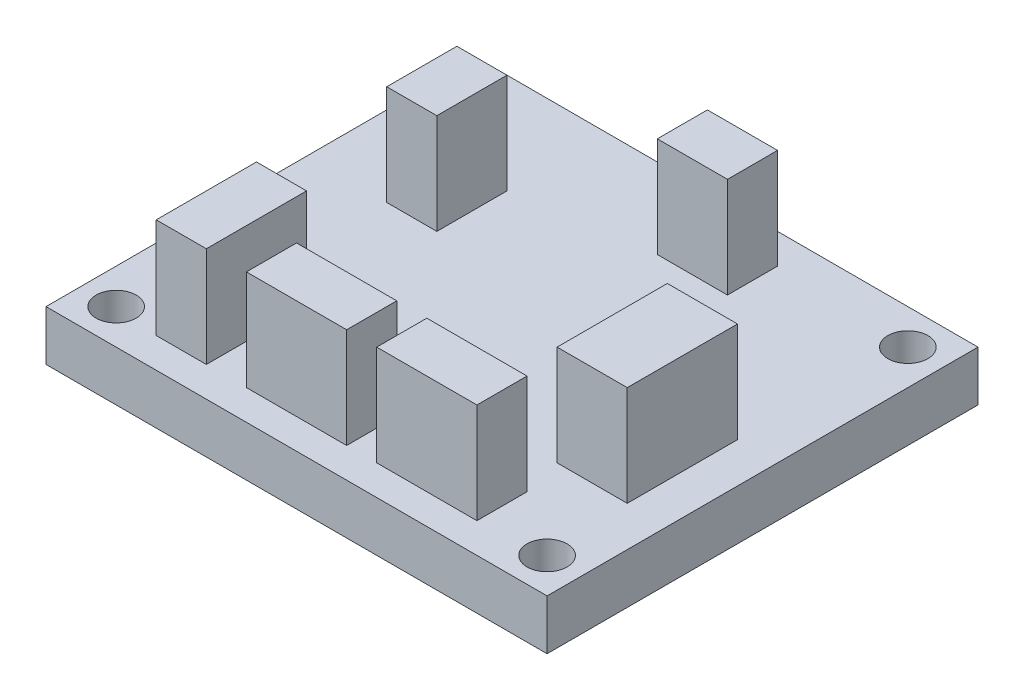
ISO-10303-21;
HEADER;
FILE_DESCRIPTION(('STEP AP214'),'2;1');
FILE_NAME('part.step','',(''),(''),'','','');
FILE_SCHEMA(('AUTOMOTIVE_DESIGN { 1 0 10303 214 1 1 1 1 }'));
ENDSEC;
DATA;
#1=APPLICATION_CONTEXT('core data for automotive mechanical design processes');
#2=APPLICATION_PROTOCOL_DEFINITION('international standard','automotive_design',2000,#1);
#3=PRODUCT_CONTEXT('',#1,'mechanical');
#4=PRODUCT('Part','Part','',(#3));
#5=PRODUCT_RELATED_PRODUCT_CATEGORY('part','',(#4));
#6=PRODUCT_DEFINITION_FORMATION('','',#4);
#7=PRODUCT_DEFINITION_CONTEXT('part definition',#1,'design');
#8=PRODUCT_DEFINITION('design','',#6,#7);
#9=PRODUCT_DEFINITION_SHAPE('','',#8);
#10=(LENGTH_UNIT() NAMED_UNIT(*) SI_UNIT(.MILLI.,.METRE.));
#11=(NAMED_UNIT(*) PLANE_ANGLE_UNIT() SI_UNIT($,.RADIAN.));
#12=(NAMED_UNIT(*) SI_UNIT($,.STERADIAN.) SOLID_ANGLE_UNIT());
#13=UNCERTAINTY_MEASURE_WITH_UNIT(LENGTH_MEASURE(1.E-05),#10,'distance_accuracy_value','');
#14=(GEOMETRIC_REPRESENTATION_CONTEXT(3) GLOBAL_UNCERTAINTY_ASSIGNED_CONTEXT((#13)) GLOBAL_UNIT_ASSIGNED_CONTEXT((#10,
#11,#12)) REPRESENTATION_CONTEXT('',''));
#15=CARTESIAN_POINT('',(0.,0.,0.));
#16=DIRECTION('',(0.,0.,1.));
#17=DIRECTION('',(1.,0.,0.));
#18=AXIS2_PLACEMENT_3D('',#15,#16,#17);
#19=CARTESIAN_POINT('',(0.,5.,0.));
#20=DIRECTION('',(0.,-1.,0.));
#21=DIRECTION('',(0.,0.,-1.));
#22=AXIS2_PLACEMENT_3D('',#19,#20,#21);
#23=PLANE('',#22);
#24=DIRECTION('',(0.,0.,-1.));
#25=VECTOR('',#24,1.);
#26=CARTESIAN_POINT('',(15.,5.,0.));
#27=LINE('',#26,#25);
#28=CARTESIAN_POINT('',(15.,5.,18.5));
#29=VERTEX_POINT('',#28);
#30=CARTESIAN_POINT('',(15.,5.,13.5));
#31=VERTEX_POINT('',#30);
#32=EDGE_CURVE('E278',#29,#31,#27,.T.);
#33=ORIENTED_EDGE('',*,*,#32,.F.);
#34=DIRECTION('',(1.,0.,0.));
#35=VECTOR('',#34,1.);
#36=CARTESIAN_POINT('',(0.,5.,18.5));
#37=LINE('',#36,#35);
#38=CARTESIAN_POINT('',(4.99999999999999,5.,18.5));
#39=VERTEX_POINT('',#38);
#40=EDGE_CURVE('E269',#39,#29,#37,.T.);
#41=ORIENTED_EDGE('',*,*,#40,.F.);
#42=DIRECTION('',(0.,0.,1.));
#43=VECTOR('',#42,1.);
#44=CARTESIAN_POINT('',(4.99999999999999,5.,0.));
#45=LINE('',#44,#43);
#46=CARTESIAN_POINT('',(4.99999999999999,5.,13.5));
#47=VERTEX_POINT('',#46);
#48=EDGE_CURVE('E272',#47,#39,#45,.T.);
#49=ORIENTED_EDGE('',*,*,#48,.F.);
#50=DIRECTION('',(-1.,0.,0.));
#51=VECTOR('',#50,1.);
#52=CARTESIAN_POINT('',(0.,5.,13.5));
#53=LINE('',#52,#51);
#54=EDGE_CURVE('E275',#31,#47,#53,.T.);
#55=ORIENTED_EDGE('',*,*,#54,.F.);
#56=EDGE_LOOP('',(#33,#41,#49,#55));
#57=FACE_BOUND('',#56,.T.);
#58=DIRECTION('',(0.,0.,1.));
#59=VECTOR('',#58,1.);
#60=CARTESIAN_POINT('',(0.999999999999995,5.,0.));
#61=LINE('',#60,#59);
#62=CARTESIAN_POINT('',(0.999999999999993,5.,-18.5));
#63=VERTEX_POINT('',#62);
#64=CARTESIAN_POINT('',(0.999999999999994,5.,-13.5));
#65=VERTEX_POINT('',#64);
#66=EDGE_CURVE('E344',#63,#65,#61,.T.);
#67=ORIENTED_EDGE('',*,*,#66,.F.);
#68=DIRECTION('',(-1.,0.,0.));
#69=VECTOR('',#68,1.);
#70=CARTESIAN_POINT('',(0.,5.,-18.5));
#71=LINE('',#70,#69);
#72=CARTESIAN_POINT('',(7.99999999999999,5.,-18.5));
#73=VERTEX_POINT('',#72);
#74=EDGE_CURVE('E335',#73,#63,#71,.T.);
#75=ORIENTED_EDGE('',*,*,#74,.F.);
#76=DIRECTION('',(0.,0.,-1.));
#77=VECTOR('',#76,1.);
#78=CARTESIAN_POINT('',(7.99999999999999,5.,0.));
#79=LINE('',#78,#77);
#80=CARTESIAN_POINT('',(7.99999999999999,5.,-13.5));
#81=VERTEX_POINT('',#80);
#82=EDGE_CURVE('E338',#81,#73,#79,.T.);
#83=ORIENTED_EDGE('',*,*,#82,.F.);
#84=DIRECTION('',(1.,0.,0.));
#85=VECTOR('',#84,1.);
#86=CARTESIAN_POINT('',(0.,5.,-13.5));
#87=LINE('',#86,#85);
#88=EDGE_CURVE('E341',#65,#81,#87,.T.);
#89=ORIENTED_EDGE('',*,*,#88,.F.);
#90=EDGE_LOOP('',(#67,#75,#83,#89));
#91=FACE_BOUND('',#90,.T.);
#92=DIRECTION('',(0.,0.,1.));
#93=VECTOR('',#92,1.);
#94=CARTESIAN_POINT('',(-17.,5.,0.));
#95=LINE('',#94,#93);
#96=CARTESIAN_POINT('',(-17.,5.,8.5));
#97=VERTEX_POINT('',#96);
#98=CARTESIAN_POINT('',(-17.,5.,18.5));
#99=VERTEX_POINT('',#98);
#100=EDGE_CURVE('E410',#97,#99,#95,.T.);
#101=ORIENTED_EDGE('',*,*,#100,.F.);
#102=DIRECTION('',(-1.,0.,0.));
#103=VECTOR('',#102,1.);
#104=CARTESIAN_POINT('',(0.,5.,8.5));
#105=LINE('',#104,#103);
#106=CARTESIAN_POINT('',(-12.,5.,8.5));
#107=VERTEX_POINT('',#106);
#108=EDGE_CURVE('E401',#107,#97,#105,.T.);
#109=ORIENTED_EDGE('',*,*,#108,.F.);
#110=DIRECTION('',(0.,0.,-1.));
#111=VECTOR('',#110,1.);
#112=CARTESIAN_POINT('',(-12.,5.,0.));
#113=LINE('',#112,#111);
#114=CARTESIAN_POINT('',(-12.,5.,18.5));
#115=VERTEX_POINT('',#114);
#116=EDGE_CURVE('E404',#115,#107,#113,.T.);
#117=ORIENTED_EDGE('',*,*,#116,.F.);
#118=DIRECTION('',(1.,0.,0.));
#119=VECTOR('',#118,1.);
#120=CARTESIAN_POINT('',(0.,5.,18.5));
#121=LINE('',#120,#119);
#122=EDGE_CURVE('E407',#99,#115,#121,.T.);
#123=ORIENTED_EDGE('',*,*,#122,.F.);
#124=EDGE_LOOP('',(#101,#109,#117,#123));
#125=FACE_BOUND('',#124,.T.);
#126=CARTESIAN_POINT('',(21.5,5.,18.));
#127=DIRECTION('',(0.,1.,0.));
#128=DIRECTION('',(0.,0.,1.));
#129=AXIS2_PLACEMENT_3D('',#126,#127,#128);
#130=CIRCLE('',#129,2.00000000000001);
#131=CARTESIAN_POINT('',(21.5,5.,20.));
#132=VERTEX_POINT('',#131);
#133=EDGE_CURVE('E420',#132,#132,#130,.T.);
#134=ORIENTED_EDGE('',*,*,#133,.F.);
#135=EDGE_LOOP('',(#134));
#136=FACE_BOUND('',#135,.T.);
#137=CARTESIAN_POINT('',(-21.5,5.,-18.));
#138=DIRECTION('',(0.,1.,0.));
#139=DIRECTION('',(0.,0.,1.));
#140=AXIS2_PLACEMENT_3D('',#137,#138,#139);
#141=CIRCLE('',#140,2.00000000000001);
#142=CARTESIAN_POINT('',(-21.5,5.,-16.));
#143=VERTEX_POINT('',#142);
#144=EDGE_CURVE('E432',#143,#143,#141,.T.);
#145=ORIENTED_EDGE('',*,*,#144,.F.);
#146=EDGE_LOOP('',(#145));
#147=FACE_BOUND('',#146,.T.);
#148=DIRECTION('',(0.,0.,-1.));
#149=VECTOR('',#148,1.);
#150=CARTESIAN_POINT('',(25.,5.,21.5));
#151=LINE('',#150,#149);
#152=CARTESIAN_POINT('',(25.,5.,21.5));
#153=VERTEX_POINT('',#152);
#154=CARTESIAN_POINT('',(25.,5.,-21.5));
#155=VERTEX_POINT('',#154);
#156=EDGE_CURVE('E438',#153,#155,#151,.T.);
#157=ORIENTED_EDGE('',*,*,#156,.T.);
#158=DIRECTION('',(-1.,0.,0.));
#159=VECTOR('',#158,1.);
#160=CARTESIAN_POINT('',(-25.,5.,-21.5));
#161=LINE('',#160,#159);
#162=CARTESIAN_POINT('',(-25.,5.,-21.5));
#163=VERTEX_POINT('',#162);
#164=EDGE_CURVE('E441',#155,#163,#161,.T.);
#165=ORIENTED_EDGE('',*,*,#164,.T.);
#166=DIRECTION('',(0.,0.,1.));
#167=VECTOR('',#166,1.);
#168=CARTESIAN_POINT('',(-25.,5.,21.5));
#169=LINE('',#168,#167);
#170=CARTESIAN_POINT('',(-25.,5.,21.5));
#171=VERTEX_POINT('',#170);
#172=EDGE_CURVE('E444',#163,#171,#169,.T.);
#173=ORIENTED_EDGE('',*,*,#172,.T.);
#174=DIRECTION('',(1.,0.,0.));
#175=VECTOR('',#174,1.);
#176=CARTESIAN_POINT('',(-25.,5.,21.5));
#177=LINE('',#176,#175);
#178=EDGE_CURVE('E446',#171,#153,#177,.T.);
#179=ORIENTED_EDGE('',*,*,#178,.T.);
#180=EDGE_LOOP('',(#157,#165,#173,#179));
#181=FACE_BOUND('',#180,.T.);
#182=CARTESIAN_POINT('',(21.5,5.,-18.));
#183=DIRECTION('',(0.,1.,0.));
#184=DIRECTION('',(0.,0.,-1.));
#185=AXIS2_PLACEMENT_3D('',#182,#183,#184);
#186=CIRCLE('',#185,2.00000000000001);
#187=CARTESIAN_POINT('',(21.5,5.,-20.));
#188=VERTEX_POINT('',#187);
#189=EDGE_CURVE('E426',#188,#188,#186,.T.);
#190=ORIENTED_EDGE('',*,*,#189,.F.);
#191=EDGE_LOOP('',(#190));
#192=FACE_BOUND('',#191,.T.);
#193=CARTESIAN_POINT('',(-21.5,5.,18.));
#194=DIRECTION('',(0.,1.,0.));
#195=DIRECTION('',(0.,0.,-1.));
#196=AXIS2_PLACEMENT_3D('',#193,#194,#195);
#197=CIRCLE('',#196,2.00000000000001);
#198=CARTESIAN_POINT('',(-21.5,5.,16.));
#199=VERTEX_POINT('',#198);
#200=EDGE_CURVE('E414',#199,#199,#197,.T.);
#201=ORIENTED_EDGE('',*,*,#200,.F.);
#202=EDGE_LOOP('',(#201));
#203=FACE_BOUND('',#202,.T.);
#204=DIRECTION('',(0.,0.,1.));
#205=VECTOR('',#204,1.);
#206=CARTESIAN_POINT('',(-17.,5.,0.));
#207=LINE('',#206,#205);
#208=CARTESIAN_POINT('',(-17.,5.,-11.5));
#209=VERTEX_POINT('',#208);
#210=CARTESIAN_POINT('',(-17.,5.,-4.5));
#211=VERTEX_POINT('',#210);
#212=EDGE_CURVE('E377',#209,#211,#207,.T.);
#213=ORIENTED_EDGE('',*,*,#212,.F.);
#214=DIRECTION('',(-1.,0.,0.));
#215=VECTOR('',#214,1.);
#216=CARTESIAN_POINT('',(0.,5.,-11.5));
#217=LINE('',#216,#215);
#218=CARTESIAN_POINT('',(-12.,5.,-11.5));
#219=VERTEX_POINT('',#218);
#220=EDGE_CURVE('E368',#219,#209,#217,.T.);
#221=ORIENTED_EDGE('',*,*,#220,.F.);
#222=DIRECTION('',(0.,0.,-1.));
#223=VECTOR('',#222,1.);
#224=CARTESIAN_POINT('',(-12.,5.,0.));
#225=LINE('',#224,#223);
#226=CARTESIAN_POINT('',(-12.,5.,-4.5));
#227=VERTEX_POINT('',#226);
#228=EDGE_CURVE('E371',#227,#219,#225,.T.);
#229=ORIENTED_EDGE('',*,*,#228,.F.);
#230=DIRECTION('',(1.,0.,0.));
#231=VECTOR('',#230,1.);
#232=CARTESIAN_POINT('',(0.,5.,-4.5));
#233=LINE('',#232,#231);
#234=EDGE_CURVE('E374',#211,#227,#233,.T.);
#235=ORIENTED_EDGE('',*,*,#234,.F.);
#236=EDGE_LOOP('',(#213,#221,#229,#235));
#237=FACE_BOUND('',#236,.T.);
#238=DIRECTION('',(0.,0.,1.));
#239=VECTOR('',#238,1.);
#240=CARTESIAN_POINT('',(14.,5.,0.));
#241=LINE('',#240,#239);
#242=CARTESIAN_POINT('',(14.,5.,-1.5));
#243=VERTEX_POINT('',#242);
#244=CARTESIAN_POINT('',(14.,5.,9.5));
#245=VERTEX_POINT('',#244);
#246=EDGE_CURVE('E311',#243,#245,#241,.T.);
#247=ORIENTED_EDGE('',*,*,#246,.F.);
#248=DIRECTION('',(-1.,0.,0.));
#249=VECTOR('',#248,1.);
#250=CARTESIAN_POINT('',(0.,5.,-1.5));
#251=LINE('',#250,#249);
#252=CARTESIAN_POINT('',(21.,5.,-1.5));
#253=VERTEX_POINT('',#252);
#254=EDGE_CURVE('E302',#253,#243,#251,.T.);
#255=ORIENTED_EDGE('',*,*,#254,.F.);
#256=DIRECTION('',(0.,0.,-1.));
#257=VECTOR('',#256,1.);
#258=CARTESIAN_POINT('',(21.,5.,0.));
#259=LINE('',#258,#257);
#260=CARTESIAN_POINT('',(21.,5.,9.5));
#261=VERTEX_POINT('',#260);
#262=EDGE_CURVE('E305',#261,#253,#259,.T.);
#263=ORIENTED_EDGE('',*,*,#262,.F.);
#264=DIRECTION('',(1.,0.,0.));
#265=VECTOR('',#264,1.);
#266=CARTESIAN_POINT('',(0.,5.,9.5));
#267=LINE('',#266,#265);
#268=EDGE_CURVE('E308',#245,#261,#267,.T.);
#269=ORIENTED_EDGE('',*,*,#268,.F.);
#270=EDGE_LOOP('',(#247,#255,#263,#269));
#271=FACE_BOUND('',#270,.T.);
#272=DIRECTION('',(0.,0.,-1.));
#273=VECTOR('',#272,1.);
#274=CARTESIAN_POINT('',(1.99999999999999,5.,0.));
#275=LINE('',#274,#273);
#276=CARTESIAN_POINT('',(1.99999999999999,5.,18.5));
#277=VERTEX_POINT('',#276);
#278=CARTESIAN_POINT('',(1.99999999999999,5.,13.5));
#279=VERTEX_POINT('',#278);
#280=EDGE_CURVE('E236',#277,#279,#275,.T.);
#281=ORIENTED_EDGE('',*,*,#280,.F.);
#282=DIRECTION('',(1.,0.,0.));
#283=VECTOR('',#282,1.);
#284=CARTESIAN_POINT('',(0.,5.,18.5));
#285=LINE('',#284,#283);
#286=CARTESIAN_POINT('',(-8.00000000000001,5.,18.5));
#287=VERTEX_POINT('',#286);
#288=EDGE_CURVE('E237',#287,#277,#285,.T.);
#289=ORIENTED_EDGE('',*,*,#288,.F.);
#290=DIRECTION('',(0.,0.,1.));
#291=VECTOR('',#290,1.);
#292=CARTESIAN_POINT('',(-8.00000000000001,5.,0.));
#293=LINE('',#292,#291);
#294=CARTESIAN_POINT('',(-8.00000000000001,5.,13.5));
#295=VERTEX_POINT('',#294);
#296=EDGE_CURVE('E52',#295,#287,#293,.T.);
#297=ORIENTED_EDGE('',*,*,#296,.F.);
#298=DIRECTION('',(-1.,0.,0.));
#299=VECTOR('',#298,1.);
#300=CARTESIAN_POINT('',(0.,5.,13.5));
#301=LINE('',#300,#299);
#302=EDGE_CURVE('E47',#279,#295,#301,.T.);
#303=ORIENTED_EDGE('',*,*,#302,.F.);
#304=EDGE_LOOP('',(#281,#289,#297,#303));
#305=FACE_BOUND('',#304,.T.);
#306=ADVANCED_FACE('F32',(#57,#91,#125,#136,#147,#181,#192,#203,#237,#271,#305),#23,.F.);
#307=CARTESIAN_POINT('',(0.,0.,0.));
#308=DIRECTION('',(0.,-1.,0.));
#309=DIRECTION('',(0.,0.,-1.));
#310=AXIS2_PLACEMENT_3D('',#307,#308,#309);
#311=PLANE('',#310);
#312=CARTESIAN_POINT('',(21.5,0.,18.));
#313=DIRECTION('',(0.,1.,0.));
#314=DIRECTION('',(0.,0.,1.));
#315=AXIS2_PLACEMENT_3D('',#312,#313,#314);
#316=CIRCLE('',#315,2.00000000000001);
#317=CARTESIAN_POINT('',(21.5,0.,20.));
#318=VERTEX_POINT('',#317);
#319=EDGE_CURVE('E417',#318,#318,#316,.T.);
#320=ORIENTED_EDGE('',*,*,#319,.T.);
#321=EDGE_LOOP('',(#320));
#322=FACE_BOUND('',#321,.T.);
#323=CARTESIAN_POINT('',(-21.5,0.,-18.));
#324=DIRECTION('',(0.,1.,0.));
#325=DIRECTION('',(0.,0.,1.));
#326=AXIS2_PLACEMENT_3D('',#323,#324,#325);
#327=CIRCLE('',#326,2.00000000000001);
#328=CARTESIAN_POINT('',(-21.5,0.,-16.));
#329=VERTEX_POINT('',#328);
#330=EDGE_CURVE('E429',#329,#329,#327,.T.);
#331=ORIENTED_EDGE('',*,*,#330,.T.);
#332=EDGE_LOOP('',(#331));
#333=FACE_BOUND('',#332,.T.);
#334=DIRECTION('',(0.,0.,-1.));
#335=VECTOR('',#334,1.);
#336=CARTESIAN_POINT('',(25.,0.,21.5));
#337=LINE('',#336,#335);
#338=CARTESIAN_POINT('',(25.,0.,21.5));
#339=VERTEX_POINT('',#338);
#340=CARTESIAN_POINT('',(25.,0.,-21.5));
#341=VERTEX_POINT('',#340);
#342=EDGE_CURVE('E435',#339,#341,#337,.T.);
#343=ORIENTED_EDGE('',*,*,#342,.F.);
#344=DIRECTION('',(1.,0.,0.));
#345=VECTOR('',#344,1.);
#346=CARTESIAN_POINT('',(-25.,0.,21.5));
#347=LINE('',#346,#345);
#348=CARTESIAN_POINT('',(-25.,0.,21.5));
#349=VERTEX_POINT('',#348);
#350=EDGE_CURVE('E442',#349,#339,#347,.T.);
#351=ORIENTED_EDGE('',*,*,#350,.F.);
#352=DIRECTION('',(0.,0.,1.));
#353=VECTOR('',#352,1.);
#354=CARTESIAN_POINT('',(-25.,0.,21.5));
#355=LINE('',#354,#353);
#356=CARTESIAN_POINT('',(-25.,0.,-21.5));
#357=VERTEX_POINT('',#356);
#358=EDGE_CURVE('E453',#357,#349,#355,.T.);
#359=ORIENTED_EDGE('',*,*,#358,.F.);
#360=DIRECTION('',(-1.,0.,0.));
#361=VECTOR('',#360,1.);
#362=CARTESIAN_POINT('',(-25.,0.,-21.5));
#363=LINE('',#362,#361);
#364=EDGE_CURVE('E451',#341,#357,#363,.T.);
#365=ORIENTED_EDGE('',*,*,#364,.F.);
#366=EDGE_LOOP('',(#343,#351,#359,#365));
#367=FACE_BOUND('',#366,.T.);
#368=CARTESIAN_POINT('',(21.5,0.,-18.));
#369=DIRECTION('',(0.,1.,0.));
#370=DIRECTION('',(0.,0.,-1.));
#371=AXIS2_PLACEMENT_3D('',#368,#369,#370);
#372=CIRCLE('',#371,2.00000000000001);
#373=CARTESIAN_POINT('',(21.5,0.,-20.));
#374=VERTEX_POINT('',#373);
#375=EDGE_CURVE('E423',#374,#374,#372,.T.);
#376=ORIENTED_EDGE('',*,*,#375,.T.);
#377=EDGE_LOOP('',(#376));
#378=FACE_BOUND('',#377,.T.);
#379=CARTESIAN_POINT('',(-21.5,0.,18.));
#380=DIRECTION('',(0.,1.,0.));
#381=DIRECTION('',(0.,0.,-1.));
#382=AXIS2_PLACEMENT_3D('',#379,#380,#381);
#383=CIRCLE('',#382,2.00000000000001);
#384=CARTESIAN_POINT('',(-21.5,0.,16.));
#385=VERTEX_POINT('',#384);
#386=EDGE_CURVE('E413',#385,#385,#383,.T.);
#387=ORIENTED_EDGE('',*,*,#386,.T.);
#388=EDGE_LOOP('',(#387));
#389=FACE_BOUND('',#388,.T.);
#390=ADVANCED_FACE('F471',(#322,#333,#367,#378,#389),#311,.T.);
#391=CARTESIAN_POINT('',(25.,5.,21.5));
#392=DIRECTION('',(-1.,0.,0.));
#393=DIRECTION('',(0.,0.,1.));
#394=AXIS2_PLACEMENT_3D('',#391,#392,#393);
#395=PLANE('',#394);
#396=ORIENTED_EDGE('',*,*,#342,.T.);
#397=DIRECTION('',(0.,-1.,0.));
#398=VECTOR('',#397,1.);
#399=CARTESIAN_POINT('',(25.,5.,-21.5));
#400=LINE('',#399,#398);
#401=EDGE_CURVE('E11',#155,#341,#400,.T.);
#402=ORIENTED_EDGE('',*,*,#401,.F.);
#403=ORIENTED_EDGE('',*,*,#156,.F.);
#404=DIRECTION('',(0.,-1.,0.));
#405=VECTOR('',#404,1.);
#406=CARTESIAN_POINT('',(25.,5.,21.5));
#407=LINE('',#406,#405);
#408=EDGE_CURVE('E448',#153,#339,#407,.T.);
#409=ORIENTED_EDGE('',*,*,#408,.T.);
#410=EDGE_LOOP('',(#396,#402,#403,#409));
#411=FACE_BOUND('',#410,.T.);
#412=ADVANCED_FACE('F34',(#411),#395,.F.);
#413=CARTESIAN_POINT('',(-25.,5.,-21.5));
#414=DIRECTION('',(0.,0.,1.));
#415=DIRECTION('',(1.,0.,0.));
#416=AXIS2_PLACEMENT_3D('',#413,#414,#415);
#417=PLANE('',#416);
#418=ORIENTED_EDGE('',*,*,#364,.T.);
#419=DIRECTION('',(0.,-1.,0.));
#420=VECTOR('',#419,1.);
#421=CARTESIAN_POINT('',(-25.,5.,-21.5));
#422=LINE('',#421,#420);
#423=EDGE_CURVE('E40',#163,#357,#422,.T.);
#424=ORIENTED_EDGE('',*,*,#423,.F.);
#425=ORIENTED_EDGE('',*,*,#164,.F.);
#426=ORIENTED_EDGE('',*,*,#401,.T.);
#427=EDGE_LOOP('',(#418,#424,#425,#426));
#428=FACE_BOUND('',#427,.T.);
#429=ADVANCED_FACE('F482',(#428),#417,.F.);
#430=CARTESIAN_POINT('',(-25.,5.,21.5));
#431=DIRECTION('',(1.,0.,0.));
#432=DIRECTION('',(0.,0.,-1.));
#433=AXIS2_PLACEMENT_3D('',#430,#431,#432);
#434=PLANE('',#433);
#435=ORIENTED_EDGE('',*,*,#358,.T.);
#436=DIRECTION('',(0.,-1.,0.));
#437=VECTOR('',#436,1.);
#438=CARTESIAN_POINT('',(-25.,5.,21.5));
#439=LINE('',#438,#437);
#440=EDGE_CURVE('E458',#171,#349,#439,.T.);
#441=ORIENTED_EDGE('',*,*,#440,.F.);
#442=ORIENTED_EDGE('',*,*,#172,.F.);
#443=ORIENTED_EDGE('',*,*,#423,.T.);
#444=EDGE_LOOP('',(#435,#441,#442,#443));
#445=FACE_BOUND('',#444,.T.);
#446=ADVANCED_FACE('F465',(#445),#434,.F.);
#447=CARTESIAN_POINT('',(-25.,5.,21.5));
#448=DIRECTION('',(0.,0.,-1.));
#449=DIRECTION('',(-1.,0.,0.));
#450=AXIS2_PLACEMENT_3D('',#447,#448,#449);
#451=PLANE('',#450);
#452=ORIENTED_EDGE('',*,*,#350,.T.);
#453=ORIENTED_EDGE('',*,*,#408,.F.);
#454=ORIENTED_EDGE('',*,*,#178,.F.);
#455=ORIENTED_EDGE('',*,*,#440,.T.);
#456=EDGE_LOOP('',(#452,#453,#454,#455));
#457=FACE_BOUND('',#456,.T.);
#458=ADVANCED_FACE('F475',(#457),#451,.F.);
#459=CARTESIAN_POINT('',(-21.5,5.,-18.));
#460=DIRECTION('',(0.,-1.,0.));
#461=DIRECTION('',(0.,0.,-1.));
#462=AXIS2_PLACEMENT_3D('',#459,#460,#461);
#463=CYLINDRICAL_SURFACE('',#462,2.00000000000001);
#464=ORIENTED_EDGE('',*,*,#144,.T.);
#465=EDGE_LOOP('',(#464));
#466=FACE_BOUND('',#465,.T.);
#467=ORIENTED_EDGE('',*,*,#330,.F.);
#468=EDGE_LOOP('',(#467));
#469=FACE_BOUND('',#468,.T.);
#470=ADVANCED_FACE('F499',(#466,#469),#463,.F.);
#471=CARTESIAN_POINT('',(21.5,5.,-18.));
#472=DIRECTION('',(0.,-1.,0.));
#473=DIRECTION('',(0.,0.,-1.));
#474=AXIS2_PLACEMENT_3D('',#471,#472,#473);
#475=CYLINDRICAL_SURFACE('',#474,2.00000000000001);
#476=ORIENTED_EDGE('',*,*,#189,.T.);
#477=EDGE_LOOP('',(#476));
#478=FACE_BOUND('',#477,.T.);
#479=ORIENTED_EDGE('',*,*,#375,.F.);
#480=EDGE_LOOP('',(#479));
#481=FACE_BOUND('',#480,.T.);
#482=ADVANCED_FACE('F506',(#478,#481),#475,.F.);
#483=CARTESIAN_POINT('',(21.5,5.,18.));
#484=DIRECTION('',(0.,-1.,0.));
#485=DIRECTION('',(0.,0.,-1.));
#486=AXIS2_PLACEMENT_3D('',#483,#484,#485);
#487=CYLINDRICAL_SURFACE('',#486,2.00000000000001);
#488=ORIENTED_EDGE('',*,*,#133,.T.);
#489=EDGE_LOOP('',(#488));
#490=FACE_BOUND('',#489,.T.);
#491=ORIENTED_EDGE('',*,*,#319,.F.);
#492=EDGE_LOOP('',(#491));
#493=FACE_BOUND('',#492,.T.);
#494=ADVANCED_FACE('F511',(#490,#493),#487,.F.);
#495=CARTESIAN_POINT('',(-21.5,5.,18.));
#496=DIRECTION('',(0.,-1.,0.));
#497=DIRECTION('',(0.,0.,-1.));
#498=AXIS2_PLACEMENT_3D('',#495,#496,#497);
#499=CYLINDRICAL_SURFACE('',#498,2.00000000000001);
#500=ORIENTED_EDGE('',*,*,#200,.T.);
#501=EDGE_LOOP('',(#500));
#502=FACE_BOUND('',#501,.T.);
#503=ORIENTED_EDGE('',*,*,#386,.F.);
#504=EDGE_LOOP('',(#503));
#505=FACE_BOUND('',#504,.T.);
#506=ADVANCED_FACE('F521',(#502,#505),#499,.F.);
#507=CARTESIAN_POINT('',(-17.,15.,8.5));
#508=DIRECTION('',(1.,0.,0.));
#509=DIRECTION('',(0.,0.,-1.));
#510=AXIS2_PLACEMENT_3D('',#507,#508,#509);
#511=PLANE('',#510);
#512=DIRECTION('',(0.,-1.,0.));
#513=VECTOR('',#512,1.);
#514=CARTESIAN_POINT('',(-17.,15.,8.5));
#515=LINE('',#514,#513);
#516=CARTESIAN_POINT('',(-17.,15.,8.5));
#517=VERTEX_POINT('',#516);
#518=EDGE_CURVE('E389',#517,#97,#515,.T.);
#519=ORIENTED_EDGE('',*,*,#518,.T.);
#520=ORIENTED_EDGE('',*,*,#100,.T.);
#521=DIRECTION('',(0.,-1.,0.));
#522=VECTOR('',#521,1.);
#523=CARTESIAN_POINT('',(-17.,15.,18.5));
#524=LINE('',#523,#522);
#525=CARTESIAN_POINT('',(-17.,15.,18.5));
#526=VERTEX_POINT('',#525);
#527=EDGE_CURVE('E398',#526,#99,#524,.T.);
#528=ORIENTED_EDGE('',*,*,#527,.F.);
#529=DIRECTION('',(0.,0.,1.));
#530=VECTOR('',#529,1.);
#531=CARTESIAN_POINT('',(-17.,15.,8.5));
#532=LINE('',#531,#530);
#533=EDGE_CURVE('E380',#517,#526,#532,.T.);
#534=ORIENTED_EDGE('',*,*,#533,.F.);
#535=EDGE_LOOP('',(#519,#520,#528,#534));
#536=FACE_BOUND('',#535,.T.);
#537=ADVANCED_FACE('F528',(#536),#511,.F.);
#538=CARTESIAN_POINT('',(-17.,15.,18.5));
#539=DIRECTION('',(0.,0.,-1.));
#540=DIRECTION('',(-1.,0.,0.));
#541=AXIS2_PLACEMENT_3D('',#538,#539,#540);
#542=PLANE('',#541);
#543=ORIENTED_EDGE('',*,*,#527,.T.);
#544=ORIENTED_EDGE('',*,*,#122,.T.);
#545=DIRECTION('',(0.,-1.,0.));
#546=VECTOR('',#545,1.);
#547=CARTESIAN_POINT('',(-12.,15.,18.5));
#548=LINE('',#547,#546);
#549=CARTESIAN_POINT('',(-12.,15.,18.5));
#550=VERTEX_POINT('',#549);
#551=EDGE_CURVE('E395',#550,#115,#548,.T.);
#552=ORIENTED_EDGE('',*,*,#551,.F.);
#553=DIRECTION('',(1.,0.,0.));
#554=VECTOR('',#553,1.);
#555=CARTESIAN_POINT('',(-17.,15.,18.5));
#556=LINE('',#555,#554);
#557=EDGE_CURVE('E383',#526,#550,#556,.T.);
#558=ORIENTED_EDGE('',*,*,#557,.F.);
#559=EDGE_LOOP('',(#543,#544,#552,#558));
#560=FACE_BOUND('',#559,.T.);
#561=ADVANCED_FACE('F532',(#560),#542,.F.);
#562=CARTESIAN_POINT('',(-12.,15.,8.5));
#563=DIRECTION('',(-1.,0.,0.));
#564=DIRECTION('',(0.,0.,1.));
#565=AXIS2_PLACEMENT_3D('',#562,#563,#564);
#566=PLANE('',#565);
#567=ORIENTED_EDGE('',*,*,#551,.T.);
#568=ORIENTED_EDGE('',*,*,#116,.T.);
#569=DIRECTION('',(0.,-1.,0.));
#570=VECTOR('',#569,1.);
#571=CARTESIAN_POINT('',(-12.,15.,8.5));
#572=LINE('',#571,#570);
#573=CARTESIAN_POINT('',(-12.,15.,8.5));
#574=VERTEX_POINT('',#573);
#575=EDGE_CURVE('E392',#574,#107,#572,.T.);
#576=ORIENTED_EDGE('',*,*,#575,.F.);
#577=DIRECTION('',(0.,0.,-1.));
#578=VECTOR('',#577,1.);
#579=CARTESIAN_POINT('',(-12.,15.,8.5));
#580=LINE('',#579,#578);
#581=EDGE_CURVE('E385',#550,#574,#580,.T.);
#582=ORIENTED_EDGE('',*,*,#581,.F.);
#583=EDGE_LOOP('',(#567,#568,#576,#582));
#584=FACE_BOUND('',#583,.T.);
#585=ADVANCED_FACE('F536',(#584),#566,.F.);
#586=CARTESIAN_POINT('',(-17.,15.,8.5));
#587=DIRECTION('',(0.,0.,1.));
#588=DIRECTION('',(1.,0.,0.));
#589=AXIS2_PLACEMENT_3D('',#586,#587,#588);
#590=PLANE('',#589);
#591=ORIENTED_EDGE('',*,*,#575,.T.);
#592=ORIENTED_EDGE('',*,*,#108,.T.);
#593=ORIENTED_EDGE('',*,*,#518,.F.);
#594=DIRECTION('',(-1.,0.,0.));
#595=VECTOR('',#594,1.);
#596=CARTESIAN_POINT('',(-17.,15.,8.5));
#597=LINE('',#596,#595);
#598=EDGE_CURVE('E387',#574,#517,#597,.T.);
#599=ORIENTED_EDGE('',*,*,#598,.F.);
#600=EDGE_LOOP('',(#591,#592,#593,#599));
#601=FACE_BOUND('',#600,.T.);
#602=ADVANCED_FACE('F540',(#601),#590,.F.);
#603=CARTESIAN_POINT('',(0.,15.,0.));
#604=DIRECTION('',(0.,1.,0.));
#605=DIRECTION('',(0.,0.,1.));
#606=AXIS2_PLACEMENT_3D('',#603,#604,#605);
#607=PLANE('',#606);
#608=ORIENTED_EDGE('',*,*,#533,.T.);
#609=ORIENTED_EDGE('',*,*,#557,.T.);
#610=ORIENTED_EDGE('',*,*,#581,.T.);
#611=ORIENTED_EDGE('',*,*,#598,.T.);
#612=EDGE_LOOP('',(#608,#609,#610,#611));
#613=FACE_BOUND('',#612,.T.);
#614=ADVANCED_FACE('F544',(#613),#607,.T.);
#615=CARTESIAN_POINT('',(-17.,15.,-11.5));
#616=DIRECTION('',(1.,0.,0.));
#617=DIRECTION('',(0.,0.,-1.));
#618=AXIS2_PLACEMENT_3D('',#615,#616,#617);
#619=PLANE('',#618);
#620=DIRECTION('',(0.,-1.,0.));
#621=VECTOR('',#620,1.);
#622=CARTESIAN_POINT('',(-17.,15.,-11.5));
#623=LINE('',#622,#621);
#624=CARTESIAN_POINT('',(-17.,15.,-11.5));
#625=VERTEX_POINT('',#624);
#626=EDGE_CURVE('E356',#625,#209,#623,.T.);
#627=ORIENTED_EDGE('',*,*,#626,.T.);
#628=ORIENTED_EDGE('',*,*,#212,.T.);
#629=DIRECTION('',(0.,-1.,0.));
#630=VECTOR('',#629,1.);
#631=CARTESIAN_POINT('',(-17.,15.,-4.5));
#632=LINE('',#631,#630);
#633=CARTESIAN_POINT('',(-17.,15.,-4.5));
#634=VERTEX_POINT('',#633);
#635=EDGE_CURVE('E365',#634,#211,#632,.T.);
#636=ORIENTED_EDGE('',*,*,#635,.F.);
#637=DIRECTION('',(0.,0.,1.));
#638=VECTOR('',#637,1.);
#639=CARTESIAN_POINT('',(-17.,15.,-11.5));
#640=LINE('',#639,#638);
#641=EDGE_CURVE('E347',#625,#634,#640,.T.);
#642=ORIENTED_EDGE('',*,*,#641,.F.);
#643=EDGE_LOOP('',(#627,#628,#636,#642));
#644=FACE_BOUND('',#643,.T.);
#645=ADVANCED_FACE('F548',(#644),#619,.F.);
#646=CARTESIAN_POINT('',(-17.,15.,-4.5));
#647=DIRECTION('',(0.,0.,-1.));
#648=DIRECTION('',(-1.,0.,0.));
#649=AXIS2_PLACEMENT_3D('',#646,#647,#648);
#650=PLANE('',#649);
#651=ORIENTED_EDGE('',*,*,#635,.T.);
#652=ORIENTED_EDGE('',*,*,#234,.T.);
#653=DIRECTION('',(0.,-1.,0.));
#654=VECTOR('',#653,1.);
#655=CARTESIAN_POINT('',(-12.,15.,-4.5));
#656=LINE('',#655,#654);
#657=CARTESIAN_POINT('',(-12.,15.,-4.5));
#658=VERTEX_POINT('',#657);
#659=EDGE_CURVE('E362',#658,#227,#656,.T.);
#660=ORIENTED_EDGE('',*,*,#659,.F.);
#661=DIRECTION('',(1.,0.,0.));
#662=VECTOR('',#661,1.);
#663=CARTESIAN_POINT('',(-17.,15.,-4.5));
#664=LINE('',#663,#662);
#665=EDGE_CURVE('E350',#634,#658,#664,.T.);
#666=ORIENTED_EDGE('',*,*,#665,.F.);
#667=EDGE_LOOP('',(#651,#652,#660,#666));
#668=FACE_BOUND('',#667,.T.);
#669=ADVANCED_FACE('F552',(#668),#650,.F.);
#670=CARTESIAN_POINT('',(-12.,15.,-11.5));
#671=DIRECTION('',(-1.,0.,0.));
#672=DIRECTION('',(0.,0.,1.));
#673=AXIS2_PLACEMENT_3D('',#670,#671,#672);
#674=PLANE('',#673);
#675=ORIENTED_EDGE('',*,*,#659,.T.);
#676=ORIENTED_EDGE('',*,*,#228,.T.);
#677=DIRECTION('',(0.,-1.,0.));
#678=VECTOR('',#677,1.);
#679=CARTESIAN_POINT('',(-12.,15.,-11.5));
#680=LINE('',#679,#678);
#681=CARTESIAN_POINT('',(-12.,15.,-11.5));
#682=VERTEX_POINT('',#681);
#683=EDGE_CURVE('E359',#682,#219,#680,.T.);
#684=ORIENTED_EDGE('',*,*,#683,.F.);
#685=DIRECTION('',(0.,0.,-1.));
#686=VECTOR('',#685,1.);
#687=CARTESIAN_POINT('',(-12.,15.,-11.5));
#688=LINE('',#687,#686);
#689=EDGE_CURVE('E352',#658,#682,#688,.T.);
#690=ORIENTED_EDGE('',*,*,#689,.F.);
#691=EDGE_LOOP('',(#675,#676,#684,#690));
#692=FACE_BOUND('',#691,.T.);
#693=ADVANCED_FACE('F556',(#692),#674,.F.);
#694=CARTESIAN_POINT('',(-17.,15.,-11.5));
#695=DIRECTION('',(0.,0.,1.));
#696=DIRECTION('',(1.,0.,0.));
#697=AXIS2_PLACEMENT_3D('',#694,#695,#696);
#698=PLANE('',#697);
#699=ORIENTED_EDGE('',*,*,#683,.T.);
#700=ORIENTED_EDGE('',*,*,#220,.T.);
#701=ORIENTED_EDGE('',*,*,#626,.F.);
#702=DIRECTION('',(-1.,0.,0.));
#703=VECTOR('',#702,1.);
#704=CARTESIAN_POINT('',(-17.,15.,-11.5));
#705=LINE('',#704,#703);
#706=EDGE_CURVE('E354',#682,#625,#705,.T.);
#707=ORIENTED_EDGE('',*,*,#706,.F.);
#708=EDGE_LOOP('',(#699,#700,#701,#707));
#709=FACE_BOUND('',#708,.T.);
#710=ADVANCED_FACE('F560',(#709),#698,.F.);
#711=CARTESIAN_POINT('',(0.,15.,0.));
#712=DIRECTION('',(0.,1.,0.));
#713=DIRECTION('',(0.,0.,1.));
#714=AXIS2_PLACEMENT_3D('',#711,#712,#713);
#715=PLANE('',#714);
#716=ORIENTED_EDGE('',*,*,#641,.T.);
#717=ORIENTED_EDGE('',*,*,#665,.T.);
#718=ORIENTED_EDGE('',*,*,#689,.T.);
#719=ORIENTED_EDGE('',*,*,#706,.T.);
#720=EDGE_LOOP('',(#716,#717,#718,#719));
#721=FACE_BOUND('',#720,.T.);
#722=ADVANCED_FACE('F564',(#721),#715,.T.);
#723=CARTESIAN_POINT('',(0.999999999999993,15.,-18.5));
#724=DIRECTION('',(1.,0.,0.));
#725=DIRECTION('',(0.,0.,-1.));
#726=AXIS2_PLACEMENT_3D('',#723,#724,#725);
#727=PLANE('',#726);
#728=DIRECTION('',(0.,-1.,0.));
#729=VECTOR('',#728,1.);
#730=CARTESIAN_POINT('',(0.999999999999993,15.,-18.5));
#731=LINE('',#730,#729);
#732=CARTESIAN_POINT('',(0.999999999999993,15.,-18.5));
#733=VERTEX_POINT('',#732);
#734=EDGE_CURVE('E323',#733,#63,#731,.T.);
#735=ORIENTED_EDGE('',*,*,#734,.T.);
#736=ORIENTED_EDGE('',*,*,#66,.T.);
#737=DIRECTION('',(0.,-1.,0.));
#738=VECTOR('',#737,1.);
#739=CARTESIAN_POINT('',(0.999999999999994,15.,-13.5));
#740=LINE('',#739,#738);
#741=CARTESIAN_POINT('',(0.999999999999994,15.,-13.5));
#742=VERTEX_POINT('',#741);
#743=EDGE_CURVE('E332',#742,#65,#740,.T.);
#744=ORIENTED_EDGE('',*,*,#743,.F.);
#745=DIRECTION('',(0.,0.,1.));
#746=VECTOR('',#745,1.);
#747=CARTESIAN_POINT('',(0.999999999999993,15.,-18.5));
#748=LINE('',#747,#746);
#749=EDGE_CURVE('E314',#733,#742,#748,.T.);
#750=ORIENTED_EDGE('',*,*,#749,.F.);
#751=EDGE_LOOP('',(#735,#736,#744,#750));
#752=FACE_BOUND('',#751,.T.);
#753=ADVANCED_FACE('F568',(#752),#727,.F.);
#754=CARTESIAN_POINT('',(0.999999999999994,15.,-13.5));
#755=DIRECTION('',(0.,0.,-1.));
#756=DIRECTION('',(-1.,0.,0.));
#757=AXIS2_PLACEMENT_3D('',#754,#755,#756);
#758=PLANE('',#757);
#759=ORIENTED_EDGE('',*,*,#743,.T.);
#760=ORIENTED_EDGE('',*,*,#88,.T.);
#761=DIRECTION('',(0.,-1.,0.));
#762=VECTOR('',#761,1.);
#763=CARTESIAN_POINT('',(7.99999999999999,15.,-13.5));
#764=LINE('',#763,#762);
#765=CARTESIAN_POINT('',(7.99999999999999,15.,-13.5));
#766=VERTEX_POINT('',#765);
#767=EDGE_CURVE('E329',#766,#81,#764,.T.);
#768=ORIENTED_EDGE('',*,*,#767,.F.);
#769=DIRECTION('',(1.,0.,0.));
#770=VECTOR('',#769,1.);
#771=CARTESIAN_POINT('',(0.999999999999994,15.,-13.5));
#772=LINE('',#771,#770);
#773=EDGE_CURVE('E317',#742,#766,#772,.T.);
#774=ORIENTED_EDGE('',*,*,#773,.F.);
#775=EDGE_LOOP('',(#759,#760,#768,#774));
#776=FACE_BOUND('',#775,.T.);
#777=ADVANCED_FACE('F572',(#776),#758,.F.);
#778=CARTESIAN_POINT('',(7.99999999999999,15.,-18.5));
#779=DIRECTION('',(-1.,0.,0.));
#780=DIRECTION('',(0.,0.,1.));
#781=AXIS2_PLACEMENT_3D('',#778,#779,#780);
#782=PLANE('',#781);
#783=ORIENTED_EDGE('',*,*,#767,.T.);
#784=ORIENTED_EDGE('',*,*,#82,.T.);
#785=DIRECTION('',(0.,-1.,0.));
#786=VECTOR('',#785,1.);
#787=CARTESIAN_POINT('',(7.99999999999999,15.,-18.5));
#788=LINE('',#787,#786);
#789=CARTESIAN_POINT('',(7.99999999999999,15.,-18.5));
#790=VERTEX_POINT('',#789);
#791=EDGE_CURVE('E326',#790,#73,#788,.T.);
#792=ORIENTED_EDGE('',*,*,#791,.F.);
#793=DIRECTION('',(0.,0.,-1.));
#794=VECTOR('',#793,1.);
#795=CARTESIAN_POINT('',(7.99999999999999,15.,-18.5));
#796=LINE('',#795,#794);
#797=EDGE_CURVE('E319',#766,#790,#796,.T.);
#798=ORIENTED_EDGE('',*,*,#797,.F.);
#799=EDGE_LOOP('',(#783,#784,#792,#798));
#800=FACE_BOUND('',#799,.T.);
#801=ADVANCED_FACE('F576',(#800),#782,.F.);
#802=CARTESIAN_POINT('',(0.999999999999993,15.,-18.5));
#803=DIRECTION('',(0.,0.,1.));
#804=DIRECTION('',(1.,0.,0.));
#805=AXIS2_PLACEMENT_3D('',#802,#803,#804);
#806=PLANE('',#805);
#807=ORIENTED_EDGE('',*,*,#791,.T.);
#808=ORIENTED_EDGE('',*,*,#74,.T.);
#809=ORIENTED_EDGE('',*,*,#734,.F.);
#810=DIRECTION('',(-1.,0.,0.));
#811=VECTOR('',#810,1.);
#812=CARTESIAN_POINT('',(0.999999999999993,15.,-18.5));
#813=LINE('',#812,#811);
#814=EDGE_CURVE('E321',#790,#733,#813,.T.);
#815=ORIENTED_EDGE('',*,*,#814,.F.);
#816=EDGE_LOOP('',(#807,#808,#809,#815));
#817=FACE_BOUND('',#816,.T.);
#818=ADVANCED_FACE('F580',(#817),#806,.F.);
#819=CARTESIAN_POINT('',(0.,15.,0.));
#820=DIRECTION('',(0.,1.,0.));
#821=DIRECTION('',(0.,0.,1.));
#822=AXIS2_PLACEMENT_3D('',#819,#820,#821);
#823=PLANE('',#822);
#824=ORIENTED_EDGE('',*,*,#749,.T.);
#825=ORIENTED_EDGE('',*,*,#773,.T.);
#826=ORIENTED_EDGE('',*,*,#797,.T.);
#827=ORIENTED_EDGE('',*,*,#814,.T.);
#828=EDGE_LOOP('',(#824,#825,#826,#827));
#829=FACE_BOUND('',#828,.T.);
#830=ADVANCED_FACE('F584',(#829),#823,.T.);
#831=CARTESIAN_POINT('',(14.,15.,-1.5));
#832=DIRECTION('',(1.,0.,0.));
#833=DIRECTION('',(0.,0.,-1.));
#834=AXIS2_PLACEMENT_3D('',#831,#832,#833);
#835=PLANE('',#834);
#836=DIRECTION('',(0.,-1.,0.));
#837=VECTOR('',#836,1.);
#838=CARTESIAN_POINT('',(14.,15.,-1.5));
#839=LINE('',#838,#837);
#840=CARTESIAN_POINT('',(14.,15.,-1.5));
#841=VERTEX_POINT('',#840);
#842=EDGE_CURVE('E290',#841,#243,#839,.T.);
#843=ORIENTED_EDGE('',*,*,#842,.T.);
#844=ORIENTED_EDGE('',*,*,#246,.T.);
#845=DIRECTION('',(0.,-1.,0.));
#846=VECTOR('',#845,1.);
#847=CARTESIAN_POINT('',(14.,15.,9.5));
#848=LINE('',#847,#846);
#849=CARTESIAN_POINT('',(14.,15.,9.5));
#850=VERTEX_POINT('',#849);
#851=EDGE_CURVE('E299',#850,#245,#848,.T.);
#852=ORIENTED_EDGE('',*,*,#851,.F.);
#853=DIRECTION('',(0.,0.,1.));
#854=VECTOR('',#853,1.);
#855=CARTESIAN_POINT('',(14.,15.,-1.5));
#856=LINE('',#855,#854);
#857=EDGE_CURVE('E281',#841,#850,#856,.T.);
#858=ORIENTED_EDGE('',*,*,#857,.F.);
#859=EDGE_LOOP('',(#843,#844,#852,#858));
#860=FACE_BOUND('',#859,.T.);
#861=ADVANCED_FACE('F588',(#860),#835,.F.);
#862=CARTESIAN_POINT('',(14.,15.,9.5));
#863=DIRECTION('',(0.,0.,-1.));
#864=DIRECTION('',(-1.,0.,0.));
#865=AXIS2_PLACEMENT_3D('',#862,#863,#864);
#866=PLANE('',#865);
#867=ORIENTED_EDGE('',*,*,#851,.T.);
#868=ORIENTED_EDGE('',*,*,#268,.T.);
#869=DIRECTION('',(0.,-1.,0.));
#870=VECTOR('',#869,1.);
#871=CARTESIAN_POINT('',(21.,15.,9.5));
#872=LINE('',#871,#870);
#873=CARTESIAN_POINT('',(21.,15.,9.5));
#874=VERTEX_POINT('',#873);
#875=EDGE_CURVE('E296',#874,#261,#872,.T.);
#876=ORIENTED_EDGE('',*,*,#875,.F.);
#877=DIRECTION('',(1.,0.,0.));
#878=VECTOR('',#877,1.);
#879=CARTESIAN_POINT('',(14.,15.,9.5));
#880=LINE('',#879,#878);
#881=EDGE_CURVE('E284',#850,#874,#880,.T.);
#882=ORIENTED_EDGE('',*,*,#881,.F.);
#883=EDGE_LOOP('',(#867,#868,#876,#882));
#884=FACE_BOUND('',#883,.T.);
#885=ADVANCED_FACE('F592',(#884),#866,.F.);
#886=CARTESIAN_POINT('',(21.,15.,-1.5));
#887=DIRECTION('',(-1.,0.,0.));
#888=DIRECTION('',(0.,0.,1.));
#889=AXIS2_PLACEMENT_3D('',#886,#887,#888);
#890=PLANE('',#889);
#891=ORIENTED_EDGE('',*,*,#875,.T.);
#892=ORIENTED_EDGE('',*,*,#262,.T.);
#893=DIRECTION('',(0.,-1.,0.));
#894=VECTOR('',#893,1.);
#895=CARTESIAN_POINT('',(21.,15.,-1.5));
#896=LINE('',#895,#894);
#897=CARTESIAN_POINT('',(21.,15.,-1.5));
#898=VERTEX_POINT('',#897);
#899=EDGE_CURVE('E293',#898,#253,#896,.T.);
#900=ORIENTED_EDGE('',*,*,#899,.F.);
#901=DIRECTION('',(0.,0.,-1.));
#902=VECTOR('',#901,1.);
#903=CARTESIAN_POINT('',(21.,15.,-1.5));
#904=LINE('',#903,#902);
#905=EDGE_CURVE('E286',#874,#898,#904,.T.);
#906=ORIENTED_EDGE('',*,*,#905,.F.);
#907=EDGE_LOOP('',(#891,#892,#900,#906));
#908=FACE_BOUND('',#907,.T.);
#909=ADVANCED_FACE('F596',(#908),#890,.F.);
#910=CARTESIAN_POINT('',(14.,15.,-1.5));
#911=DIRECTION('',(0.,0.,1.));
#912=DIRECTION('',(1.,0.,0.));
#913=AXIS2_PLACEMENT_3D('',#910,#911,#912);
#914=PLANE('',#913);
#915=ORIENTED_EDGE('',*,*,#899,.T.);
#916=ORIENTED_EDGE('',*,*,#254,.T.);
#917=ORIENTED_EDGE('',*,*,#842,.F.);
#918=DIRECTION('',(-1.,0.,0.));
#919=VECTOR('',#918,1.);
#920=CARTESIAN_POINT('',(14.,15.,-1.5));
#921=LINE('',#920,#919);
#922=EDGE_CURVE('E288',#898,#841,#921,.T.);
#923=ORIENTED_EDGE('',*,*,#922,.F.);
#924=EDGE_LOOP('',(#915,#916,#917,#923));
#925=FACE_BOUND('',#924,.T.);
#926=ADVANCED_FACE('F600',(#925),#914,.F.);
#927=CARTESIAN_POINT('',(0.,15.,0.));
#928=DIRECTION('',(0.,1.,0.));
#929=DIRECTION('',(0.,0.,1.));
#930=AXIS2_PLACEMENT_3D('',#927,#928,#929);
#931=PLANE('',#930);
#932=ORIENTED_EDGE('',*,*,#857,.T.);
#933=ORIENTED_EDGE('',*,*,#881,.T.);
#934=ORIENTED_EDGE('',*,*,#905,.T.);
#935=ORIENTED_EDGE('',*,*,#922,.T.);
#936=EDGE_LOOP('',(#932,#933,#934,#935));
#937=FACE_BOUND('',#936,.T.);
#938=ADVANCED_FACE('F604',(#937),#931,.T.);
#939=CARTESIAN_POINT('',(15.,15.,13.5));
#940=DIRECTION('',(-1.,0.,0.));
#941=DIRECTION('',(0.,0.,1.));
#942=AXIS2_PLACEMENT_3D('',#939,#940,#941);
#943=PLANE('',#942);
#944=DIRECTION('',(0.,-1.,0.));
#945=VECTOR('',#944,1.);
#946=CARTESIAN_POINT('',(15.,15.,18.5));
#947=LINE('',#946,#945);
#948=CARTESIAN_POINT('',(15.,15.,18.5));
#949=VERTEX_POINT('',#948);
#950=EDGE_CURVE('E257',#949,#29,#947,.T.);
#951=ORIENTED_EDGE('',*,*,#950,.T.);
#952=ORIENTED_EDGE('',*,*,#32,.T.);
#953=DIRECTION('',(0.,-1.,0.));
#954=VECTOR('',#953,1.);
#955=CARTESIAN_POINT('',(15.,15.,13.5));
#956=LINE('',#955,#954);
#957=CARTESIAN_POINT('',(15.,15.,13.5));
#958=VERTEX_POINT('',#957);
#959=EDGE_CURVE('E266',#958,#31,#956,.T.);
#960=ORIENTED_EDGE('',*,*,#959,.F.);
#961=DIRECTION('',(0.,0.,-1.));
#962=VECTOR('',#961,1.);
#963=CARTESIAN_POINT('',(15.,15.,13.5));
#964=LINE('',#963,#962);
#965=EDGE_CURVE('E248',#949,#958,#964,.T.);
#966=ORIENTED_EDGE('',*,*,#965,.F.);
#967=EDGE_LOOP('',(#951,#952,#960,#966));
#968=FACE_BOUND('',#967,.T.);
#969=ADVANCED_FACE('F608',(#968),#943,.F.);
#970=CARTESIAN_POINT('',(15.,15.,13.5));
#971=DIRECTION('',(0.,0.,1.));
#972=DIRECTION('',(1.,0.,0.));
#973=AXIS2_PLACEMENT_3D('',#970,#971,#972);
#974=PLANE('',#973);
#975=ORIENTED_EDGE('',*,*,#959,.T.);
#976=ORIENTED_EDGE('',*,*,#54,.T.);
#977=DIRECTION('',(0.,-1.,0.));
#978=VECTOR('',#977,1.);
#979=CARTESIAN_POINT('',(4.99999999999999,15.,13.5));
#980=LINE('',#979,#978);
#981=CARTESIAN_POINT('',(4.99999999999999,15.,13.5));
#982=VERTEX_POINT('',#981);
#983=EDGE_CURVE('E263',#982,#47,#980,.T.);
#984=ORIENTED_EDGE('',*,*,#983,.F.);
#985=DIRECTION('',(-1.,0.,0.));
#986=VECTOR('',#985,1.);
#987=CARTESIAN_POINT('',(15.,15.,13.5));
#988=LINE('',#987,#986);
#989=EDGE_CURVE('E251',#958,#982,#988,.T.);
#990=ORIENTED_EDGE('',*,*,#989,.F.);
#991=EDGE_LOOP('',(#975,#976,#984,#990));
#992=FACE_BOUND('',#991,.T.);
#993=ADVANCED_FACE('F612',(#992),#974,.F.);
#994=CARTESIAN_POINT('',(4.99999999999999,15.,13.5));
#995=DIRECTION('',(1.,0.,0.));
#996=DIRECTION('',(0.,0.,-1.));
#997=AXIS2_PLACEMENT_3D('',#994,#995,#996);
#998=PLANE('',#997);
#999=ORIENTED_EDGE('',*,*,#983,.T.);
#1000=ORIENTED_EDGE('',*,*,#48,.T.);
#1001=DIRECTION('',(0.,-1.,0.));
#1002=VECTOR('',#1001,1.);
#1003=CARTESIAN_POINT('',(4.99999999999999,15.,18.5));
#1004=LINE('',#1003,#1002);
#1005=CARTESIAN_POINT('',(4.99999999999999,15.,18.5));
#1006=VERTEX_POINT('',#1005);
#1007=EDGE_CURVE('E260',#1006,#39,#1004,.T.);
#1008=ORIENTED_EDGE('',*,*,#1007,.F.);
#1009=DIRECTION('',(0.,0.,1.));
#1010=VECTOR('',#1009,1.);
#1011=CARTESIAN_POINT('',(4.99999999999999,15.,13.5));
#1012=LINE('',#1011,#1010);
#1013=EDGE_CURVE('E253',#982,#1006,#1012,.T.);
#1014=ORIENTED_EDGE('',*,*,#1013,.F.);
#1015=EDGE_LOOP('',(#999,#1000,#1008,#1014));
#1016=FACE_BOUND('',#1015,.T.);
#1017=ADVANCED_FACE('F616',(#1016),#998,.F.);
#1018=CARTESIAN_POINT('',(15.,15.,18.5));
#1019=DIRECTION('',(0.,0.,-1.));
#1020=DIRECTION('',(-1.,0.,0.));
#1021=AXIS2_PLACEMENT_3D('',#1018,#1019,#1020);
#1022=PLANE('',#1021);
#1023=ORIENTED_EDGE('',*,*,#1007,.T.);
#1024=ORIENTED_EDGE('',*,*,#40,.T.);
#1025=ORIENTED_EDGE('',*,*,#950,.F.);
#1026=DIRECTION('',(1.,0.,0.));
#1027=VECTOR('',#1026,1.);
#1028=CARTESIAN_POINT('',(15.,15.,18.5));
#1029=LINE('',#1028,#1027);
#1030=EDGE_CURVE('E255',#1006,#949,#1029,.T.);
#1031=ORIENTED_EDGE('',*,*,#1030,.F.);
#1032=EDGE_LOOP('',(#1023,#1024,#1025,#1031));
#1033=FACE_BOUND('',#1032,.T.);
#1034=ADVANCED_FACE('F620',(#1033),#1022,.F.);
#1035=CARTESIAN_POINT('',(0.,15.,0.));
#1036=DIRECTION('',(0.,-1.,0.));
#1037=DIRECTION('',(0.,0.,-1.));
#1038=AXIS2_PLACEMENT_3D('',#1035,#1036,#1037);
#1039=PLANE('',#1038);
#1040=ORIENTED_EDGE('',*,*,#965,.T.);
#1041=ORIENTED_EDGE('',*,*,#989,.T.);
#1042=ORIENTED_EDGE('',*,*,#1013,.T.);
#1043=ORIENTED_EDGE('',*,*,#1030,.T.);
#1044=EDGE_LOOP('',(#1040,#1041,#1042,#1043));
#1045=FACE_BOUND('',#1044,.T.);
#1046=ADVANCED_FACE('F624',(#1045),#1039,.F.);
#1047=CARTESIAN_POINT('',(1.99999999999999,15.,18.5));
#1048=DIRECTION('',(-1.,0.,0.));
#1049=DIRECTION('',(0.,0.,1.));
#1050=AXIS2_PLACEMENT_3D('',#1047,#1048,#1049);
#1051=PLANE('',#1050);
#1052=DIRECTION('',(0.,-1.,0.));
#1053=VECTOR('',#1052,1.);
#1054=CARTESIAN_POINT('',(1.99999999999999,15.,18.5));
#1055=LINE('',#1054,#1053);
#1056=CARTESIAN_POINT('',(1.99999999999999,15.,18.5));
#1057=VERTEX_POINT('',#1056);
#1058=EDGE_CURVE('E874',#1057,#277,#1055,.T.);
#1059=ORIENTED_EDGE('',*,*,#1058,.T.);
#1060=ORIENTED_EDGE('',*,*,#280,.T.);
#1061=DIRECTION('',(0.,-1.,0.));
#1062=VECTOR('',#1061,1.);
#1063=CARTESIAN_POINT('',(1.99999999999999,15.,13.5));
#1064=LINE('',#1063,#1062);
#1065=CARTESIAN_POINT('',(1.99999999999999,15.,13.5));
#1066=VERTEX_POINT('',#1065);
#1067=EDGE_CURVE('E219',#1066,#279,#1064,.T.);
#1068=ORIENTED_EDGE('',*,*,#1067,.F.);
#1069=DIRECTION('',(0.,0.,-1.));
#1070=VECTOR('',#1069,1.);
#1071=CARTESIAN_POINT('',(1.99999999999999,15.,18.5));
#1072=LINE('',#1071,#1070);
#1073=EDGE_CURVE('E225',#1057,#1066,#1072,.T.);
#1074=ORIENTED_EDGE('',*,*,#1073,.F.);
#1075=EDGE_LOOP('',(#1059,#1060,#1068,#1074));
#1076=FACE_BOUND('',#1075,.T.);
#1077=ADVANCED_FACE('F235',(#1076),#1051,.F.);
#1078=CARTESIAN_POINT('',(1.99999999999999,15.,13.5));
#1079=DIRECTION('',(0.,0.,1.));
#1080=DIRECTION('',(1.,0.,0.));
#1081=AXIS2_PLACEMENT_3D('',#1078,#1079,#1080);
#1082=PLANE('',#1081);
#1083=ORIENTED_EDGE('',*,*,#1067,.T.);
#1084=ORIENTED_EDGE('',*,*,#302,.T.);
#1085=DIRECTION('',(0.,-1.,0.));
#1086=VECTOR('',#1085,1.);
#1087=CARTESIAN_POINT('',(-8.00000000000001,15.,13.5));
#1088=LINE('',#1087,#1086);
#1089=CARTESIAN_POINT('',(-8.00000000000001,15.,13.5));
#1090=VERTEX_POINT('',#1089);
#1091=EDGE_CURVE('E221',#1090,#295,#1088,.T.);
#1092=ORIENTED_EDGE('',*,*,#1091,.F.);
#1093=DIRECTION('',(-1.,0.,0.));
#1094=VECTOR('',#1093,1.);
#1095=CARTESIAN_POINT('',(1.99999999999999,15.,13.5));
#1096=LINE('',#1095,#1094);
#1097=EDGE_CURVE('E215',#1066,#1090,#1096,.T.);
#1098=ORIENTED_EDGE('',*,*,#1097,.F.);
#1099=EDGE_LOOP('',(#1083,#1084,#1092,#1098));
#1100=FACE_BOUND('',#1099,.T.);
#1101=ADVANCED_FACE('F217',(#1100),#1082,.F.);
#1102=CARTESIAN_POINT('',(-8.00000000000001,15.,18.5));
#1103=DIRECTION('',(1.,0.,0.));
#1104=DIRECTION('',(0.,0.,-1.));
#1105=AXIS2_PLACEMENT_3D('',#1102,#1103,#1104);
#1106=PLANE('',#1105);
#1107=ORIENTED_EDGE('',*,*,#1091,.T.);
#1108=ORIENTED_EDGE('',*,*,#296,.T.);
#1109=DIRECTION('',(0.,-1.,0.));
#1110=VECTOR('',#1109,1.);
#1111=CARTESIAN_POINT('',(-8.00000000000001,15.,18.5));
#1112=LINE('',#1111,#1110);
#1113=CARTESIAN_POINT('',(-8.00000000000001,15.,18.5));
#1114=VERTEX_POINT('',#1113);
#1115=EDGE_CURVE('E241',#1114,#287,#1112,.T.);
#1116=ORIENTED_EDGE('',*,*,#1115,.F.);
#1117=DIRECTION('',(0.,0.,1.));
#1118=VECTOR('',#1117,1.);
#1119=CARTESIAN_POINT('',(-8.00000000000001,15.,18.5));
#1120=LINE('',#1119,#1118);
#1121=EDGE_CURVE('E224',#1090,#1114,#1120,.T.);
#1122=ORIENTED_EDGE('',*,*,#1121,.F.);
#1123=EDGE_LOOP('',(#1107,#1108,#1116,#1122));
#1124=FACE_BOUND('',#1123,.T.);
#1125=ADVANCED_FACE('F633',(#1124),#1106,.F.);
#1126=CARTESIAN_POINT('',(1.99999999999999,15.,18.5));
#1127=DIRECTION('',(0.,0.,-1.));
#1128=DIRECTION('',(-1.,0.,0.));
#1129=AXIS2_PLACEMENT_3D('',#1126,#1127,#1128);
#1130=PLANE('',#1129);
#1131=ORIENTED_EDGE('',*,*,#1115,.T.);
#1132=ORIENTED_EDGE('',*,*,#288,.T.);
#1133=ORIENTED_EDGE('',*,*,#1058,.F.);
#1134=DIRECTION('',(1.,0.,0.));
#1135=VECTOR('',#1134,1.);
#1136=CARTESIAN_POINT('',(1.99999999999999,15.,18.5));
#1137=LINE('',#1136,#1135);
#1138=EDGE_CURVE('E230',#1114,#1057,#1137,.T.);
#1139=ORIENTED_EDGE('',*,*,#1138,.F.);
#1140=EDGE_LOOP('',(#1131,#1132,#1133,#1139));
#1141=FACE_BOUND('',#1140,.T.);
#1142=ADVANCED_FACE('F636',(#1141),#1130,.F.);
#1143=CARTESIAN_POINT('',(0.,15.,0.));
#1144=DIRECTION('',(0.,1.,0.));
#1145=DIRECTION('',(0.,0.,1.));
#1146=AXIS2_PLACEMENT_3D('',#1143,#1144,#1145);
#1147=PLANE('',#1146);
#1148=ORIENTED_EDGE('',*,*,#1073,.T.);
#1149=ORIENTED_EDGE('',*,*,#1097,.T.);
#1150=ORIENTED_EDGE('',*,*,#1121,.T.);
#1151=ORIENTED_EDGE('',*,*,#1138,.T.);
#1152=EDGE_LOOP('',(#1148,#1149,#1150,#1151));
#1153=FACE_BOUND('',#1152,.T.);
#1154=ADVANCED_FACE('F228',(#1153),#1147,.T.);
#1155=CLOSED_SHELL('',(#306,#390,#412,#429,#446,#458,#470,#482,#494,#506,#537,#561,#585,#602,
#614,#645,#669,#693,#710,#722,#753,#777,#801,#818,#830,#861,#885,#909,#926,#938,#969,#993,#1017,
#1034,#1046,#1077,#1101,#1125,#1142,#1154));
#1156=MANIFOLD_SOLID_BREP('B2',#1155);
#1157=ADVANCED_BREP_SHAPE_REPRESENTATION('',(#18,#1156),#14);
#1158=SHAPE_DEFINITION_REPRESENTATION(#9,#1157);
ENDSEC;
END-ISO-10303-21;
